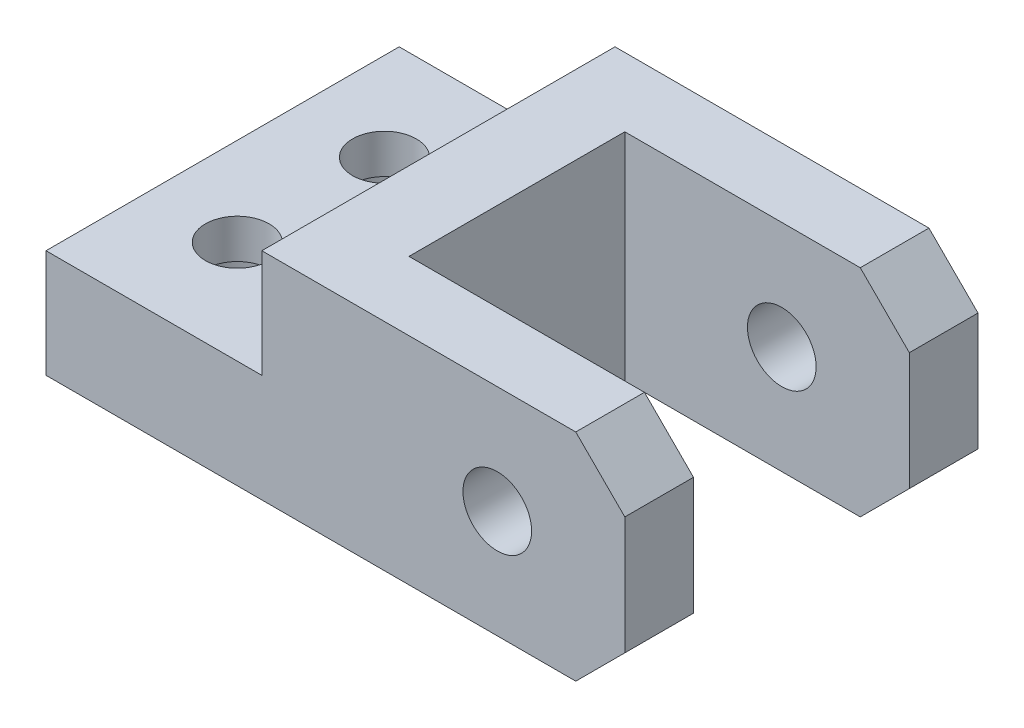
ISO-10303-21;
HEADER;
FILE_DESCRIPTION(('STEP AP214'),'2;1');
FILE_NAME('part.step','',(''),(''),'','','');
FILE_SCHEMA(('AUTOMOTIVE_DESIGN { 1 0 10303 214 1 1 1 1 }'));
ENDSEC;
DATA;
#1=APPLICATION_CONTEXT('core data for automotive mechanical design processes');
#2=APPLICATION_PROTOCOL_DEFINITION('international standard','automotive_design',2000,#1);
#3=PRODUCT_CONTEXT('',#1,'mechanical');
#4=PRODUCT('Part','Part','',(#3));
#5=PRODUCT_RELATED_PRODUCT_CATEGORY('part','',(#4));
#6=PRODUCT_DEFINITION_FORMATION('','',#4);
#7=PRODUCT_DEFINITION_CONTEXT('part definition',#1,'design');
#8=PRODUCT_DEFINITION('design','',#6,#7);
#9=PRODUCT_DEFINITION_SHAPE('','',#8);
#10=(LENGTH_UNIT() NAMED_UNIT(*) SI_UNIT(.MILLI.,.METRE.));
#11=(NAMED_UNIT(*) PLANE_ANGLE_UNIT() SI_UNIT($,.RADIAN.));
#12=(NAMED_UNIT(*) SI_UNIT($,.STERADIAN.) SOLID_ANGLE_UNIT());
#13=UNCERTAINTY_MEASURE_WITH_UNIT(LENGTH_MEASURE(1.E-05),#10,'distance_accuracy_value','');
#14=(GEOMETRIC_REPRESENTATION_CONTEXT(3) GLOBAL_UNCERTAINTY_ASSIGNED_CONTEXT((#13)) GLOBAL_UNIT_ASSIGNED_CONTEXT((#10,
#11,#12)) REPRESENTATION_CONTEXT('',''));
#15=CARTESIAN_POINT('',(0.,0.,0.));
#16=DIRECTION('',(0.,0.,1.));
#17=DIRECTION('',(1.,0.,0.));
#18=AXIS2_PLACEMENT_3D('',#15,#16,#17);
#19=CARTESIAN_POINT('',(32.,11.,-36.));
#20=DIRECTION('',(0.707106781186548,0.707106781186547,0.));
#21=DIRECTION('',(-0.707106781186547,0.707106781186548,0.));
#22=AXIS2_PLACEMENT_3D('',#19,#20,#21);
#23=PLANE('',#22);
#24=DIRECTION('',(0.707106781186547,-0.707106781186548,0.));
#25=VECTOR('',#24,1.);
#26=CARTESIAN_POINT('',(32.,11.,-7.00000000000001));
#27=LINE('',#26,#25);
#28=CARTESIAN_POINT('',(32.,11.,-7.00000000000001));
#29=VERTEX_POINT('',#28);
#30=CARTESIAN_POINT('',(37.,5.99999999999999,-7.00000000000001));
#31=VERTEX_POINT('',#30);
#32=EDGE_CURVE('E221',#29,#31,#27,.T.);
#33=ORIENTED_EDGE('',*,*,#32,.F.);
#34=DIRECTION('',(0.,0.,1.));
#35=VECTOR('',#34,1.);
#36=CARTESIAN_POINT('',(32.,11.,-36.));
#37=LINE('',#36,#35);
#38=CARTESIAN_POINT('',(32.,11.,0.));
#39=VERTEX_POINT('',#38);
#40=EDGE_CURVE('E126',#29,#39,#37,.T.);
#41=ORIENTED_EDGE('',*,*,#40,.T.);
#42=DIRECTION('',(-0.707106781186547,0.707106781186548,0.));
#43=VECTOR('',#42,1.);
#44=CARTESIAN_POINT('',(32.,11.,0.));
#45=LINE('',#44,#43);
#46=CARTESIAN_POINT('',(37.,5.99999999999999,0.));
#47=VERTEX_POINT('',#46);
#48=EDGE_CURVE('E162',#47,#39,#45,.T.);
#49=ORIENTED_EDGE('',*,*,#48,.F.);
#50=DIRECTION('',(0.,0.,1.));
#51=VECTOR('',#50,1.);
#52=CARTESIAN_POINT('',(37.,5.99999999999999,-36.));
#53=LINE('',#52,#51);
#54=EDGE_CURVE('E175',#31,#47,#53,.T.);
#55=ORIENTED_EDGE('',*,*,#54,.F.);
#56=EDGE_LOOP('',(#33,#41,#49,#55));
#57=FACE_BOUND('',#56,.T.);
#58=ADVANCED_FACE('F30',(#57),#23,.T.);
#59=CARTESIAN_POINT('',(37.,5.99999999999999,-36.));
#60=DIRECTION('',(1.,0.,0.));
#61=DIRECTION('',(0.,0.,-1.));
#62=AXIS2_PLACEMENT_3D('',#59,#60,#61);
#63=PLANE('',#62);
#64=DIRECTION('',(0.,-1.,0.));
#65=VECTOR('',#64,1.);
#66=CARTESIAN_POINT('',(37.,-12.9732943341057,-7.00000000000001));
#67=LINE('',#66,#65);
#68=CARTESIAN_POINT('',(37.,-6.,-7.00000000000001));
#69=VERTEX_POINT('',#68);
#70=EDGE_CURVE('E286',#31,#69,#67,.T.);
#71=ORIENTED_EDGE('',*,*,#70,.F.);
#72=ORIENTED_EDGE('',*,*,#54,.T.);
#73=DIRECTION('',(0.,1.,0.));
#74=VECTOR('',#73,1.);
#75=CARTESIAN_POINT('',(37.,5.99999999999999,0.));
#76=LINE('',#75,#74);
#77=CARTESIAN_POINT('',(37.,-6.,0.));
#78=VERTEX_POINT('',#77);
#79=EDGE_CURVE('E159',#78,#47,#76,.T.);
#80=ORIENTED_EDGE('',*,*,#79,.F.);
#81=DIRECTION('',(0.,0.,1.));
#82=VECTOR('',#81,1.);
#83=CARTESIAN_POINT('',(37.,-6.,-36.));
#84=LINE('',#83,#82);
#85=EDGE_CURVE('E179',#69,#78,#84,.T.);
#86=ORIENTED_EDGE('',*,*,#85,.F.);
#87=EDGE_LOOP('',(#71,#72,#80,#86));
#88=FACE_BOUND('',#87,.T.);
#89=ADVANCED_FACE('F291',(#88),#63,.T.);
#90=CARTESIAN_POINT('',(37.,-6.,-36.));
#91=DIRECTION('',(0.707106781186548,-0.707106781186547,0.));
#92=DIRECTION('',(0.707106781186547,0.707106781186548,0.));
#93=AXIS2_PLACEMENT_3D('',#90,#91,#92);
#94=PLANE('',#93);
#95=DIRECTION('',(-0.707106781186547,-0.707106781186548,0.));
#96=VECTOR('',#95,1.);
#97=CARTESIAN_POINT('',(37.,-6.,-7.00000000000001));
#98=LINE('',#97,#96);
#99=CARTESIAN_POINT('',(32.,-11.,-7.00000000000001));
#100=VERTEX_POINT('',#99);
#101=EDGE_CURVE('E206',#69,#100,#98,.T.);
#102=ORIENTED_EDGE('',*,*,#101,.F.);
#103=ORIENTED_EDGE('',*,*,#85,.T.);
#104=DIRECTION('',(0.707106781186547,0.707106781186548,0.));
#105=VECTOR('',#104,1.);
#106=CARTESIAN_POINT('',(37.,-6.,0.));
#107=LINE('',#106,#105);
#108=CARTESIAN_POINT('',(32.,-11.,0.));
#109=VERTEX_POINT('',#108);
#110=EDGE_CURVE('E156',#109,#78,#107,.T.);
#111=ORIENTED_EDGE('',*,*,#110,.F.);
#112=DIRECTION('',(0.,0.,1.));
#113=VECTOR('',#112,1.);
#114=CARTESIAN_POINT('',(32.,-11.,-36.));
#115=LINE('',#114,#113);
#116=EDGE_CURVE('E183',#100,#109,#115,.T.);
#117=ORIENTED_EDGE('',*,*,#116,.F.);
#118=EDGE_LOOP('',(#102,#103,#111,#117));
#119=FACE_BOUND('',#118,.T.);
#120=ADVANCED_FACE('F320',(#119),#94,.T.);
#121=CARTESIAN_POINT('',(24.,0.,-36.));
#122=DIRECTION('',(0.,0.,1.));
#123=DIRECTION('',(1.,0.,0.));
#124=AXIS2_PLACEMENT_3D('',#121,#122,#123);
#125=CYLINDRICAL_SURFACE('',#124,3.5);
#126=CARTESIAN_POINT('',(24.,0.,-7.00000000000001));
#127=DIRECTION('',(0.,0.,1.));
#128=DIRECTION('',(1.,0.,0.));
#129=AXIS2_PLACEMENT_3D('',#126,#127,#128);
#130=CIRCLE('',#129,3.5);
#131=CARTESIAN_POINT('',(27.5,0.,-7.00000000000001));
#132=VERTEX_POINT('',#131);
#133=EDGE_CURVE('E201',#132,#132,#130,.F.);
#134=ORIENTED_EDGE('',*,*,#133,.T.);
#135=EDGE_LOOP('',(#134));
#136=FACE_BOUND('',#135,.T.);
#137=CARTESIAN_POINT('',(24.,0.,0.));
#138=DIRECTION('',(0.,0.,1.));
#139=DIRECTION('',(1.,0.,0.));
#140=AXIS2_PLACEMENT_3D('',#137,#138,#139);
#141=CIRCLE('',#140,3.5);
#142=CARTESIAN_POINT('',(27.5,0.,0.));
#143=VERTEX_POINT('',#142);
#144=EDGE_CURVE('E190',#143,#143,#141,.T.);
#145=ORIENTED_EDGE('',*,*,#144,.T.);
#146=EDGE_LOOP('',(#145));
#147=FACE_BOUND('',#146,.T.);
#148=ADVANCED_FACE('F322',(#136,#147),#125,.F.);
#149=CARTESIAN_POINT('',(-22.,0.,-36.));
#150=DIRECTION('',(0.,1.,0.));
#151=DIRECTION('',(0.,0.,1.));
#152=AXIS2_PLACEMENT_3D('',#149,#150,#151);
#153=PLANE('',#152);
#154=CARTESIAN_POINT('',(-13.,0.,-25.5));
#155=DIRECTION('',(0.,1.,0.));
#156=DIRECTION('',(0.,0.,1.));
#157=AXIS2_PLACEMENT_3D('',#154,#155,#156);
#158=CIRCLE('',#157,3.25);
#159=CARTESIAN_POINT('',(-13.,0.,-22.25));
#160=VERTEX_POINT('',#159);
#161=EDGE_CURVE('E192',#160,#160,#158,.T.);
#162=ORIENTED_EDGE('',*,*,#161,.F.);
#163=EDGE_LOOP('',(#162));
#164=FACE_BOUND('',#163,.T.);
#165=CARTESIAN_POINT('',(-13.,0.,-10.5));
#166=DIRECTION('',(0.,1.,0.));
#167=DIRECTION('',(0.,0.,1.));
#168=AXIS2_PLACEMENT_3D('',#165,#166,#167);
#169=CIRCLE('',#168,3.25);
#170=CARTESIAN_POINT('',(-13.,0.,-7.25));
#171=VERTEX_POINT('',#170);
#172=EDGE_CURVE('E187',#171,#171,#169,.T.);
#173=ORIENTED_EDGE('',*,*,#172,.F.);
#174=EDGE_LOOP('',(#173));
#175=FACE_BOUND('',#174,.T.);
#176=DIRECTION('',(-1.,0.,0.));
#177=VECTOR('',#176,1.);
#178=CARTESIAN_POINT('',(-22.,0.,0.));
#179=LINE('',#178,#177);
#180=CARTESIAN_POINT('',(0.,0.,0.));
#181=VERTEX_POINT('',#180);
#182=CARTESIAN_POINT('',(-22.,0.,0.));
#183=VERTEX_POINT('',#182);
#184=EDGE_CURVE('E146',#181,#183,#179,.T.);
#185=ORIENTED_EDGE('',*,*,#184,.F.);
#186=DIRECTION('',(0.,0.,1.));
#187=VECTOR('',#186,1.);
#188=CARTESIAN_POINT('',(0.,0.,-36.));
#189=LINE('',#188,#187);
#190=CARTESIAN_POINT('',(0.,0.,-36.));
#191=VERTEX_POINT('',#190);
#192=EDGE_CURVE('E38',#191,#181,#189,.T.);
#193=ORIENTED_EDGE('',*,*,#192,.F.);
#194=DIRECTION('',(-1.,0.,0.));
#195=VECTOR('',#194,1.);
#196=CARTESIAN_POINT('',(-22.,0.,-36.));
#197=LINE('',#196,#195);
#198=CARTESIAN_POINT('',(-22.,0.,-36.));
#199=VERTEX_POINT('',#198);
#200=EDGE_CURVE('E171',#191,#199,#197,.T.);
#201=ORIENTED_EDGE('',*,*,#200,.T.);
#202=DIRECTION('',(0.,0.,1.));
#203=VECTOR('',#202,1.);
#204=CARTESIAN_POINT('',(-22.,0.,-36.));
#205=LINE('',#204,#203);
#206=EDGE_CURVE('E92',#199,#183,#205,.T.);
#207=ORIENTED_EDGE('',*,*,#206,.T.);
#208=EDGE_LOOP('',(#185,#193,#201,#207));
#209=FACE_BOUND('',#208,.T.);
#210=ADVANCED_FACE('F32',(#164,#175,#209),#153,.T.);
#211=CARTESIAN_POINT('',(0.,0.,-36.));
#212=DIRECTION('',(-1.,0.,0.));
#213=DIRECTION('',(0.,-1.,0.));
#214=AXIS2_PLACEMENT_3D('',#211,#212,#213);
#215=PLANE('',#214);
#216=DIRECTION('',(0.,-1.,0.));
#217=VECTOR('',#216,1.);
#218=CARTESIAN_POINT('',(0.,0.,0.));
#219=LINE('',#218,#217);
#220=CARTESIAN_POINT('',(0.,11.,0.));
#221=VERTEX_POINT('',#220);
#222=EDGE_CURVE('E168',#221,#181,#219,.T.);
#223=ORIENTED_EDGE('',*,*,#222,.F.);
#224=DIRECTION('',(0.,0.,1.));
#225=VECTOR('',#224,1.);
#226=CARTESIAN_POINT('',(0.,11.,-36.));
#227=LINE('',#226,#225);
#228=CARTESIAN_POINT('',(0.,11.,-36.));
#229=VERTEX_POINT('',#228);
#230=EDGE_CURVE('E125',#229,#221,#227,.T.);
#231=ORIENTED_EDGE('',*,*,#230,.F.);
#232=DIRECTION('',(0.,-1.,0.));
#233=VECTOR('',#232,1.);
#234=CARTESIAN_POINT('',(0.,0.,-36.));
#235=LINE('',#234,#233);
#236=EDGE_CURVE('E134',#229,#191,#235,.T.);
#237=ORIENTED_EDGE('',*,*,#236,.T.);
#238=ORIENTED_EDGE('',*,*,#192,.T.);
#239=EDGE_LOOP('',(#223,#231,#237,#238));
#240=FACE_BOUND('',#239,.T.);
#241=ADVANCED_FACE('F271',(#240),#215,.T.);
#242=CARTESIAN_POINT('',(0.,11.,-36.));
#243=DIRECTION('',(0.,1.,0.));
#244=DIRECTION('',(-1.,0.,0.));
#245=AXIS2_PLACEMENT_3D('',#242,#243,#244);
#246=PLANE('',#245);
#247=DIRECTION('',(1.,0.,0.));
#248=VECTOR('',#247,1.);
#249=CARTESIAN_POINT('',(0.,11.,-7.00000000000001));
#250=LINE('',#249,#248);
#251=CARTESIAN_POINT('',(8.,11.,-7.00000000000001));
#252=VERTEX_POINT('',#251);
#253=EDGE_CURVE('E224',#252,#29,#250,.T.);
#254=ORIENTED_EDGE('',*,*,#253,.F.);
#255=DIRECTION('',(0.,0.,-1.));
#256=VECTOR('',#255,1.);
#257=CARTESIAN_POINT('',(8.,11.,-36.));
#258=LINE('',#257,#256);
#259=CARTESIAN_POINT('',(8.,11.,-29.));
#260=VERTEX_POINT('',#259);
#261=EDGE_CURVE('E227',#252,#260,#258,.T.);
#262=ORIENTED_EDGE('',*,*,#261,.T.);
#263=DIRECTION('',(-1.,0.,0.));
#264=VECTOR('',#263,1.);
#265=CARTESIAN_POINT('',(0.,11.,-29.));
#266=LINE('',#265,#264);
#267=CARTESIAN_POINT('',(32.,11.,-29.));
#268=VERTEX_POINT('',#267);
#269=EDGE_CURVE('E121',#268,#260,#266,.T.);
#270=ORIENTED_EDGE('',*,*,#269,.F.);
#271=CARTESIAN_POINT('',(32.,11.,-36.));
#272=VERTEX_POINT('',#271);
#273=EDGE_CURVE('E112',#272,#268,#37,.T.);
#274=ORIENTED_EDGE('',*,*,#273,.F.);
#275=DIRECTION('',(-1.,0.,0.));
#276=VECTOR('',#275,1.);
#277=CARTESIAN_POINT('',(0.,11.,-36.));
#278=LINE('',#277,#276);
#279=EDGE_CURVE('E116',#272,#229,#278,.T.);
#280=ORIENTED_EDGE('',*,*,#279,.T.);
#281=ORIENTED_EDGE('',*,*,#230,.T.);
#282=DIRECTION('',(-1.,0.,0.));
#283=VECTOR('',#282,1.);
#284=CARTESIAN_POINT('',(0.,11.,0.));
#285=LINE('',#284,#283);
#286=EDGE_CURVE('E165',#39,#221,#285,.T.);
#287=ORIENTED_EDGE('',*,*,#286,.F.);
#288=ORIENTED_EDGE('',*,*,#40,.F.);
#289=EDGE_LOOP('',(#254,#262,#270,#274,#280,#281,#287,#288));
#290=FACE_BOUND('',#289,.T.);
#291=ADVANCED_FACE('F115',(#290),#246,.T.);
#292=DIRECTION('',(-0.707106781186547,0.707106781186548,0.));
#293=VECTOR('',#292,1.);
#294=CARTESIAN_POINT('',(32.,11.,-29.));
#295=LINE('',#294,#293);
#296=CARTESIAN_POINT('',(37.,5.99999999999999,-29.));
#297=VERTEX_POINT('',#296);
#298=EDGE_CURVE('E208',#297,#268,#295,.T.);
#299=ORIENTED_EDGE('',*,*,#298,.F.);
#300=CARTESIAN_POINT('',(37.,5.99999999999999,-36.));
#301=VERTEX_POINT('',#300);
#302=EDGE_CURVE('E138',#301,#297,#53,.T.);
#303=ORIENTED_EDGE('',*,*,#302,.F.);
#304=DIRECTION('',(-0.707106781186547,0.707106781186548,0.));
#305=VECTOR('',#304,1.);
#306=CARTESIAN_POINT('',(32.,11.,-36.));
#307=LINE('',#306,#305);
#308=EDGE_CURVE('E132',#301,#272,#307,.T.);
#309=ORIENTED_EDGE('',*,*,#308,.T.);
#310=ORIENTED_EDGE('',*,*,#273,.T.);
#311=EDGE_LOOP('',(#299,#303,#309,#310));
#312=FACE_BOUND('',#311,.T.);
#313=ADVANCED_FACE('F136',(#312),#23,.T.);
#314=DIRECTION('',(0.,1.,0.));
#315=VECTOR('',#314,1.);
#316=CARTESIAN_POINT('',(37.,-12.9732943341057,-29.));
#317=LINE('',#316,#315);
#318=CARTESIAN_POINT('',(37.,-6.,-29.));
#319=VERTEX_POINT('',#318);
#320=EDGE_CURVE('E292',#319,#297,#317,.T.);
#321=ORIENTED_EDGE('',*,*,#320,.F.);
#322=CARTESIAN_POINT('',(37.,-6.,-36.));
#323=VERTEX_POINT('',#322);
#324=EDGE_CURVE('E176',#323,#319,#84,.T.);
#325=ORIENTED_EDGE('',*,*,#324,.F.);
#326=DIRECTION('',(0.,1.,0.));
#327=VECTOR('',#326,1.);
#328=CARTESIAN_POINT('',(37.,5.99999999999999,-36.));
#329=LINE('',#328,#327);
#330=EDGE_CURVE('E139',#323,#301,#329,.T.);
#331=ORIENTED_EDGE('',*,*,#330,.T.);
#332=ORIENTED_EDGE('',*,*,#302,.T.);
#333=EDGE_LOOP('',(#321,#325,#331,#332));
#334=FACE_BOUND('',#333,.T.);
#335=ADVANCED_FACE('F307',(#334),#63,.T.);
#336=DIRECTION('',(0.707106781186547,0.707106781186548,0.));
#337=VECTOR('',#336,1.);
#338=CARTESIAN_POINT('',(37.,-6.,-29.));
#339=LINE('',#338,#337);
#340=CARTESIAN_POINT('',(32.,-11.,-29.));
#341=VERTEX_POINT('',#340);
#342=EDGE_CURVE('E215',#341,#319,#339,.T.);
#343=ORIENTED_EDGE('',*,*,#342,.F.);
#344=CARTESIAN_POINT('',(32.,-11.,-36.));
#345=VERTEX_POINT('',#344);
#346=EDGE_CURVE('E180',#345,#341,#115,.T.);
#347=ORIENTED_EDGE('',*,*,#346,.F.);
#348=DIRECTION('',(0.707106781186547,0.707106781186548,0.));
#349=VECTOR('',#348,1.);
#350=CARTESIAN_POINT('',(37.,-6.,-36.));
#351=LINE('',#350,#349);
#352=EDGE_CURVE('E141',#345,#323,#351,.T.);
#353=ORIENTED_EDGE('',*,*,#352,.T.);
#354=ORIENTED_EDGE('',*,*,#324,.T.);
#355=EDGE_LOOP('',(#343,#347,#353,#354));
#356=FACE_BOUND('',#355,.T.);
#357=ADVANCED_FACE('F257',(#356),#94,.T.);
#358=CARTESIAN_POINT('',(32.,-11.,-36.));
#359=DIRECTION('',(0.,-1.,0.));
#360=DIRECTION('',(1.,0.,0.));
#361=AXIS2_PLACEMENT_3D('',#358,#359,#360);
#362=PLANE('',#361);
#363=DIRECTION('',(-1.,0.,0.));
#364=VECTOR('',#363,1.);
#365=CARTESIAN_POINT('',(32.,-11.,-7.00000000000001));
#366=LINE('',#365,#364);
#367=CARTESIAN_POINT('',(8.,-11.,-7.00000000000001));
#368=VERTEX_POINT('',#367);
#369=EDGE_CURVE('E203',#100,#368,#366,.T.);
#370=ORIENTED_EDGE('',*,*,#369,.F.);
#371=ORIENTED_EDGE('',*,*,#116,.T.);
#372=DIRECTION('',(1.,0.,0.));
#373=VECTOR('',#372,1.);
#374=CARTESIAN_POINT('',(32.,-11.,0.));
#375=LINE('',#374,#373);
#376=CARTESIAN_POINT('',(-22.,-11.,0.));
#377=VERTEX_POINT('',#376);
#378=EDGE_CURVE('E153',#377,#109,#375,.T.);
#379=ORIENTED_EDGE('',*,*,#378,.F.);
#380=DIRECTION('',(0.,0.,1.));
#381=VECTOR('',#380,1.);
#382=CARTESIAN_POINT('',(-22.,-11.,-36.));
#383=LINE('',#382,#381);
#384=CARTESIAN_POINT('',(-22.,-11.,-36.));
#385=VERTEX_POINT('',#384);
#386=EDGE_CURVE('E184',#385,#377,#383,.T.);
#387=ORIENTED_EDGE('',*,*,#386,.F.);
#388=DIRECTION('',(1.,0.,0.));
#389=VECTOR('',#388,1.);
#390=CARTESIAN_POINT('',(32.,-11.,-36.));
#391=LINE('',#390,#389);
#392=EDGE_CURVE('E251',#385,#345,#391,.T.);
#393=ORIENTED_EDGE('',*,*,#392,.T.);
#394=ORIENTED_EDGE('',*,*,#346,.T.);
#395=DIRECTION('',(1.,0.,0.));
#396=VECTOR('',#395,1.);
#397=CARTESIAN_POINT('',(32.,-11.,-29.));
#398=LINE('',#397,#396);
#399=CARTESIAN_POINT('',(8.,-11.,-29.));
#400=VERTEX_POINT('',#399);
#401=EDGE_CURVE('E199',#400,#341,#398,.T.);
#402=ORIENTED_EDGE('',*,*,#401,.F.);
#403=DIRECTION('',(0.,0.,1.));
#404=VECTOR('',#403,1.);
#405=CARTESIAN_POINT('',(8.,-11.,-36.));
#406=LINE('',#405,#404);
#407=EDGE_CURVE('E11',#400,#368,#406,.T.);
#408=ORIENTED_EDGE('',*,*,#407,.T.);
#409=EDGE_LOOP('',(#370,#371,#379,#387,#393,#394,#402,#408));
#410=FACE_BOUND('',#409,.T.);
#411=CARTESIAN_POINT('',(-13.,-11.,-25.5));
#412=DIRECTION('',(0.,-1.,0.));
#413=DIRECTION('',(0.,0.,-1.));
#414=AXIS2_PLACEMENT_3D('',#411,#412,#413);
#415=CIRCLE('',#414,5.99999999999999);
#416=CARTESIAN_POINT('',(-13.,-11.,-31.5));
#417=VERTEX_POINT('',#416);
#418=EDGE_CURVE('E196',#417,#417,#415,.T.);
#419=ORIENTED_EDGE('',*,*,#418,.F.);
#420=EDGE_LOOP('',(#419));
#421=FACE_BOUND('',#420,.T.);
#422=CARTESIAN_POINT('',(-13.,-11.,-10.5));
#423=DIRECTION('',(0.,-1.,0.));
#424=DIRECTION('',(0.,0.,-1.));
#425=AXIS2_PLACEMENT_3D('',#422,#423,#424);
#426=CIRCLE('',#425,5.99999999999999);
#427=CARTESIAN_POINT('',(-13.,-11.,-16.5));
#428=VERTEX_POINT('',#427);
#429=EDGE_CURVE('E191',#428,#428,#426,.T.);
#430=ORIENTED_EDGE('',*,*,#429,.F.);
#431=EDGE_LOOP('',(#430));
#432=FACE_BOUND('',#431,.T.);
#433=ADVANCED_FACE('F262',(#410,#421,#432),#362,.T.);
#434=CARTESIAN_POINT('',(-22.,-11.,-36.));
#435=DIRECTION('',(-1.,0.,0.));
#436=DIRECTION('',(0.,0.,1.));
#437=AXIS2_PLACEMENT_3D('',#434,#435,#436);
#438=PLANE('',#437);
#439=DIRECTION('',(0.,-1.,0.));
#440=VECTOR('',#439,1.);
#441=CARTESIAN_POINT('',(-22.,-11.,0.));
#442=LINE('',#441,#440);
#443=EDGE_CURVE('E149',#183,#377,#442,.T.);
#444=ORIENTED_EDGE('',*,*,#443,.F.);
#445=ORIENTED_EDGE('',*,*,#206,.F.);
#446=DIRECTION('',(0.,-1.,0.));
#447=VECTOR('',#446,1.);
#448=CARTESIAN_POINT('',(-22.,-11.,-36.));
#449=LINE('',#448,#447);
#450=EDGE_CURVE('E249',#199,#385,#449,.T.);
#451=ORIENTED_EDGE('',*,*,#450,.T.);
#452=ORIENTED_EDGE('',*,*,#386,.T.);
#453=EDGE_LOOP('',(#444,#445,#451,#452));
#454=FACE_BOUND('',#453,.T.);
#455=ADVANCED_FACE('F267',(#454),#438,.T.);
#456=CARTESIAN_POINT('',(37.,0.,-36.));
#457=DIRECTION('',(0.,0.,-1.));
#458=DIRECTION('',(-1.,0.,0.));
#459=AXIS2_PLACEMENT_3D('',#456,#457,#458);
#460=PLANE('',#459);
#461=CARTESIAN_POINT('',(24.,0.,-36.));
#462=DIRECTION('',(0.,0.,1.));
#463=DIRECTION('',(1.,0.,0.));
#464=AXIS2_PLACEMENT_3D('',#461,#462,#463);
#465=CIRCLE('',#464,3.5);
#466=CARTESIAN_POINT('',(27.5,0.,-36.));
#467=VERTEX_POINT('',#466);
#468=EDGE_CURVE('E150',#467,#467,#465,.T.);
#469=ORIENTED_EDGE('',*,*,#468,.T.);
#470=EDGE_LOOP('',(#469));
#471=FACE_BOUND('',#470,.T.);
#472=ORIENTED_EDGE('',*,*,#200,.F.);
#473=ORIENTED_EDGE('',*,*,#236,.F.);
#474=ORIENTED_EDGE('',*,*,#279,.F.);
#475=ORIENTED_EDGE('',*,*,#308,.F.);
#476=ORIENTED_EDGE('',*,*,#330,.F.);
#477=ORIENTED_EDGE('',*,*,#352,.F.);
#478=ORIENTED_EDGE('',*,*,#392,.F.);
#479=ORIENTED_EDGE('',*,*,#450,.F.);
#480=EDGE_LOOP('',(#472,#473,#474,#475,#476,#477,#478,#479));
#481=FACE_BOUND('',#480,.T.);
#482=ADVANCED_FACE('F130',(#471,#481),#460,.T.);
#483=CARTESIAN_POINT('',(37.,0.,0.));
#484=DIRECTION('',(0.,0.,-1.));
#485=DIRECTION('',(-1.,0.,0.));
#486=AXIS2_PLACEMENT_3D('',#483,#484,#485);
#487=PLANE('',#486);
#488=ORIENTED_EDGE('',*,*,#144,.F.);
#489=EDGE_LOOP('',(#488));
#490=FACE_BOUND('',#489,.T.);
#491=ORIENTED_EDGE('',*,*,#184,.T.);
#492=ORIENTED_EDGE('',*,*,#443,.T.);
#493=ORIENTED_EDGE('',*,*,#378,.T.);
#494=ORIENTED_EDGE('',*,*,#110,.T.);
#495=ORIENTED_EDGE('',*,*,#79,.T.);
#496=ORIENTED_EDGE('',*,*,#48,.T.);
#497=ORIENTED_EDGE('',*,*,#286,.T.);
#498=ORIENTED_EDGE('',*,*,#222,.T.);
#499=EDGE_LOOP('',(#491,#492,#493,#494,#495,#496,#497,#498));
#500=FACE_BOUND('',#499,.T.);
#501=ADVANCED_FACE('F269',(#490,#500),#487,.F.);
#502=CARTESIAN_POINT('',(24.,0.,-29.));
#503=DIRECTION('',(0.,0.,-1.));
#504=DIRECTION('',(0.,1.,0.));
#505=AXIS2_PLACEMENT_3D('',#502,#503,#504);
#506=CIRCLE('',#505,3.5);
#507=CARTESIAN_POINT('',(24.,3.5,-29.));
#508=VERTEX_POINT('',#507);
#509=EDGE_CURVE('E197',#508,#508,#506,.F.);
#510=ORIENTED_EDGE('',*,*,#509,.T.);
#511=EDGE_LOOP('',(#510));
#512=FACE_BOUND('',#511,.T.);
#513=ORIENTED_EDGE('',*,*,#468,.F.);
#514=EDGE_LOOP('',(#513));
#515=FACE_BOUND('',#514,.T.);
#516=ADVANCED_FACE('F329',(#512,#515),#125,.F.);
#517=CARTESIAN_POINT('',(-13.,-11.,-10.5));
#518=DIRECTION('',(0.,-1.,0.));
#519=DIRECTION('',(0.,0.,-1.));
#520=AXIS2_PLACEMENT_3D('',#517,#518,#519);
#521=CYLINDRICAL_SURFACE('',#520,5.99999999999999);
#522=CARTESIAN_POINT('',(-13.,-4.00000000000001,-10.5));
#523=DIRECTION('',(0.,-1.,0.));
#524=DIRECTION('',(0.,0.,-1.));
#525=AXIS2_PLACEMENT_3D('',#522,#523,#524);
#526=CIRCLE('',#525,5.99999999999999);
#527=CARTESIAN_POINT('',(-13.,-4.00000000000001,-16.5));
#528=VERTEX_POINT('',#527);
#529=EDGE_CURVE('E239',#528,#528,#526,.T.);
#530=ORIENTED_EDGE('',*,*,#529,.F.);
#531=EDGE_LOOP('',(#530));
#532=FACE_BOUND('',#531,.T.);
#533=ORIENTED_EDGE('',*,*,#429,.T.);
#534=EDGE_LOOP('',(#533));
#535=FACE_BOUND('',#534,.T.);
#536=ADVANCED_FACE('F355',(#532,#535),#521,.F.);
#537=CARTESIAN_POINT('',(-9.75000000000001,-4.00000000000001,-10.5));
#538=DIRECTION('',(0.,1.,0.));
#539=DIRECTION('',(0.,0.,1.));
#540=AXIS2_PLACEMENT_3D('',#537,#538,#539);
#541=PLANE('',#540);
#542=CARTESIAN_POINT('',(-13.,-4.00000000000001,-10.5));
#543=DIRECTION('',(0.,-1.,0.));
#544=DIRECTION('',(0.,0.,-1.));
#545=AXIS2_PLACEMENT_3D('',#542,#543,#544);
#546=CIRCLE('',#545,3.25);
#547=CARTESIAN_POINT('',(-13.,-4.00000000000001,-13.75));
#548=VERTEX_POINT('',#547);
#549=EDGE_CURVE('E195',#548,#548,#546,.T.);
#550=ORIENTED_EDGE('',*,*,#549,.F.);
#551=EDGE_LOOP('',(#550));
#552=FACE_BOUND('',#551,.T.);
#553=ORIENTED_EDGE('',*,*,#529,.T.);
#554=EDGE_LOOP('',(#553));
#555=FACE_BOUND('',#554,.T.);
#556=ADVANCED_FACE('F359',(#552,#555),#541,.F.);
#557=CARTESIAN_POINT('',(-13.,-11.,-10.5));
#558=DIRECTION('',(0.,-1.,0.));
#559=DIRECTION('',(0.,0.,-1.));
#560=AXIS2_PLACEMENT_3D('',#557,#558,#559);
#561=CYLINDRICAL_SURFACE('',#560,3.25);
#562=ORIENTED_EDGE('',*,*,#172,.T.);
#563=EDGE_LOOP('',(#562));
#564=FACE_BOUND('',#563,.T.);
#565=ORIENTED_EDGE('',*,*,#549,.T.);
#566=EDGE_LOOP('',(#565));
#567=FACE_BOUND('',#566,.T.);
#568=ADVANCED_FACE('F363',(#564,#567),#561,.F.);
#569=CARTESIAN_POINT('',(-13.,-11.,-25.5));
#570=DIRECTION('',(0.,-1.,0.));
#571=DIRECTION('',(0.,0.,-1.));
#572=AXIS2_PLACEMENT_3D('',#569,#570,#571);
#573=CYLINDRICAL_SURFACE('',#572,5.99999999999999);
#574=CARTESIAN_POINT('',(-13.,-4.00000000000001,-25.5));
#575=DIRECTION('',(0.,-1.,0.));
#576=DIRECTION('',(0.,0.,-1.));
#577=AXIS2_PLACEMENT_3D('',#574,#575,#576);
#578=CIRCLE('',#577,5.99999999999999);
#579=CARTESIAN_POINT('',(-13.,-4.00000000000001,-31.5));
#580=VERTEX_POINT('',#579);
#581=EDGE_CURVE('E232',#580,#580,#578,.T.);
#582=ORIENTED_EDGE('',*,*,#581,.F.);
#583=EDGE_LOOP('',(#582));
#584=FACE_BOUND('',#583,.T.);
#585=ORIENTED_EDGE('',*,*,#418,.T.);
#586=EDGE_LOOP('',(#585));
#587=FACE_BOUND('',#586,.T.);
#588=ADVANCED_FACE('F367',(#584,#587),#573,.F.);
#589=CARTESIAN_POINT('',(-9.75000000000001,-4.00000000000001,-25.5));
#590=DIRECTION('',(0.,1.,0.));
#591=DIRECTION('',(0.,0.,1.));
#592=AXIS2_PLACEMENT_3D('',#589,#590,#591);
#593=PLANE('',#592);
#594=CARTESIAN_POINT('',(-13.,-4.00000000000001,-25.5));
#595=DIRECTION('',(0.,-1.,0.));
#596=DIRECTION('',(0.,0.,-1.));
#597=AXIS2_PLACEMENT_3D('',#594,#595,#596);
#598=CIRCLE('',#597,3.25);
#599=CARTESIAN_POINT('',(-13.,-4.00000000000001,-28.75));
#600=VERTEX_POINT('',#599);
#601=EDGE_CURVE('E229',#600,#600,#598,.T.);
#602=ORIENTED_EDGE('',*,*,#601,.F.);
#603=EDGE_LOOP('',(#602));
#604=FACE_BOUND('',#603,.T.);
#605=ORIENTED_EDGE('',*,*,#581,.T.);
#606=EDGE_LOOP('',(#605));
#607=FACE_BOUND('',#606,.T.);
#608=ADVANCED_FACE('F371',(#604,#607),#593,.F.);
#609=CARTESIAN_POINT('',(-13.,-11.,-25.5));
#610=DIRECTION('',(0.,-1.,0.));
#611=DIRECTION('',(0.,0.,-1.));
#612=AXIS2_PLACEMENT_3D('',#609,#610,#611);
#613=CYLINDRICAL_SURFACE('',#612,3.25);
#614=ORIENTED_EDGE('',*,*,#161,.T.);
#615=EDGE_LOOP('',(#614));
#616=FACE_BOUND('',#615,.T.);
#617=ORIENTED_EDGE('',*,*,#601,.T.);
#618=EDGE_LOOP('',(#617));
#619=FACE_BOUND('',#618,.T.);
#620=ADVANCED_FACE('F375',(#616,#619),#613,.F.);
#621=CARTESIAN_POINT('',(8.,-12.9732943341057,-7.00000000000001));
#622=DIRECTION('',(0.,0.,1.));
#623=DIRECTION('',(1.,0.,0.));
#624=AXIS2_PLACEMENT_3D('',#621,#622,#623);
#625=PLANE('',#624);
#626=ORIENTED_EDGE('',*,*,#253,.T.);
#627=ORIENTED_EDGE('',*,*,#32,.T.);
#628=ORIENTED_EDGE('',*,*,#70,.T.);
#629=ORIENTED_EDGE('',*,*,#101,.T.);
#630=ORIENTED_EDGE('',*,*,#369,.T.);
#631=DIRECTION('',(0.,-1.,0.));
#632=VECTOR('',#631,1.);
#633=CARTESIAN_POINT('',(8.,-12.9732943341057,-7.00000000000001));
#634=LINE('',#633,#632);
#635=EDGE_CURVE('E45',#252,#368,#634,.T.);
#636=ORIENTED_EDGE('',*,*,#635,.F.);
#637=EDGE_LOOP('',(#626,#627,#628,#629,#630,#636));
#638=FACE_BOUND('',#637,.T.);
#639=ORIENTED_EDGE('',*,*,#133,.F.);
#640=EDGE_LOOP('',(#639));
#641=FACE_BOUND('',#640,.T.);
#642=ADVANCED_FACE('F283',(#638,#641),#625,.F.);
#643=CARTESIAN_POINT('',(8.,-12.9732943341057,-29.));
#644=DIRECTION('',(0.,0.,-1.));
#645=DIRECTION('',(0.,1.,0.));
#646=AXIS2_PLACEMENT_3D('',#643,#644,#645);
#647=PLANE('',#646);
#648=ORIENTED_EDGE('',*,*,#269,.T.);
#649=DIRECTION('',(0.,1.,0.));
#650=VECTOR('',#649,1.);
#651=CARTESIAN_POINT('',(8.,-12.9732943341057,-29.));
#652=LINE('',#651,#650);
#653=EDGE_CURVE('E200',#400,#260,#652,.T.);
#654=ORIENTED_EDGE('',*,*,#653,.F.);
#655=ORIENTED_EDGE('',*,*,#401,.T.);
#656=ORIENTED_EDGE('',*,*,#342,.T.);
#657=ORIENTED_EDGE('',*,*,#320,.T.);
#658=ORIENTED_EDGE('',*,*,#298,.T.);
#659=EDGE_LOOP('',(#648,#654,#655,#656,#657,#658));
#660=FACE_BOUND('',#659,.T.);
#661=ORIENTED_EDGE('',*,*,#509,.F.);
#662=EDGE_LOOP('',(#661));
#663=FACE_BOUND('',#662,.T.);
#664=ADVANCED_FACE('F302',(#660,#663),#647,.F.);
#665=CARTESIAN_POINT('',(8.,-12.9732943341057,-7.00000000000001));
#666=DIRECTION('',(1.,0.,0.));
#667=DIRECTION('',(0.,0.,-1.));
#668=AXIS2_PLACEMENT_3D('',#665,#666,#667);
#669=PLANE('',#668);
#670=ORIENTED_EDGE('',*,*,#635,.T.);
#671=ORIENTED_EDGE('',*,*,#407,.F.);
#672=ORIENTED_EDGE('',*,*,#653,.T.);
#673=ORIENTED_EDGE('',*,*,#261,.F.);
#674=EDGE_LOOP('',(#670,#671,#672,#673));
#675=FACE_BOUND('',#674,.T.);
#676=ADVANCED_FACE('F384',(#675),#669,.T.);
#677=CLOSED_SHELL('',(#58,#89,#120,#148,#210,#241,#291,#313,#335,#357,#433,#455,#482,#501,#516,
#536,#556,#568,#588,#608,#620,#642,#664,#676));
#678=MANIFOLD_SOLID_BREP('B2',#677);
#679=ADVANCED_BREP_SHAPE_REPRESENTATION('',(#18,#678),#14);
#680=SHAPE_DEFINITION_REPRESENTATION(#9,#679);
ENDSEC;
END-ISO-10303-21;
